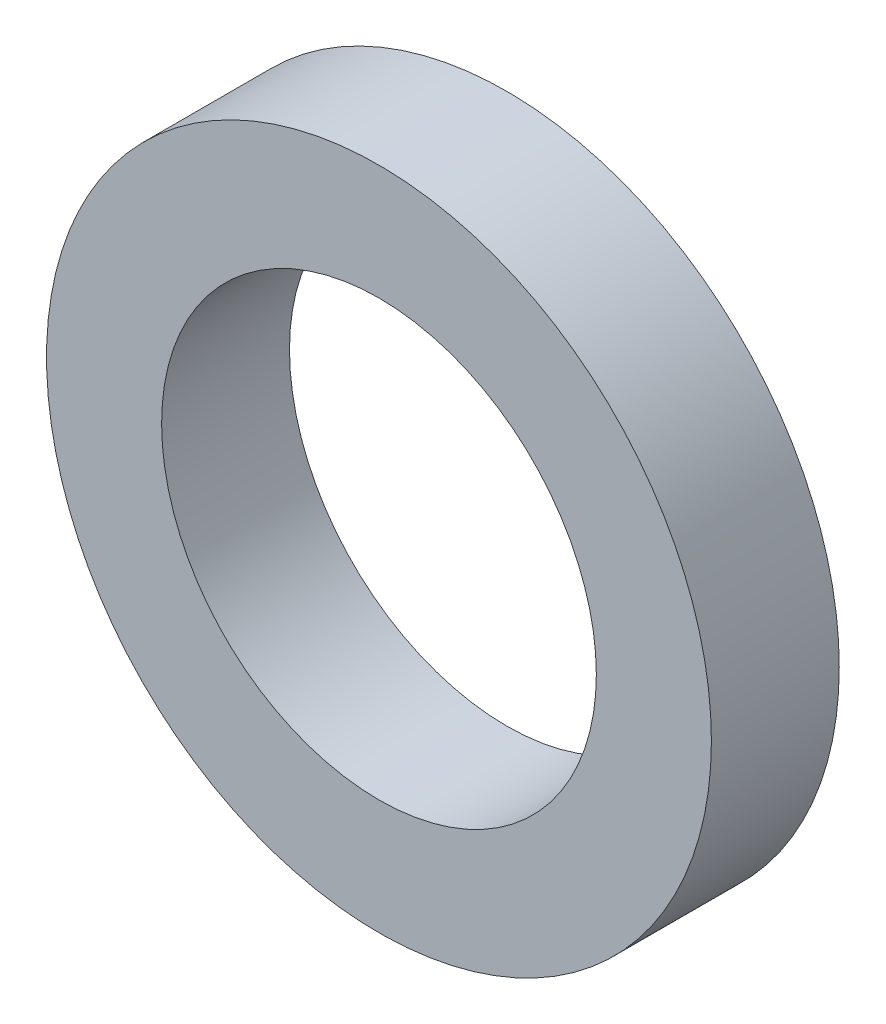
ISO-10303-21;
HEADER;
FILE_DESCRIPTION(('STEP AP214'),'2;1');
FILE_NAME('part.step','',(''),(''),'','','');
FILE_SCHEMA(('AUTOMOTIVE_DESIGN { 1 0 10303 214 1 1 1 1 }'));
ENDSEC;
DATA;
#1=APPLICATION_CONTEXT('core data for automotive mechanical design processes');
#2=APPLICATION_PROTOCOL_DEFINITION('international standard','automotive_design',2000,#1);
#3=PRODUCT_CONTEXT('',#1,'mechanical');
#4=PRODUCT('Part','Part','',(#3));
#5=PRODUCT_RELATED_PRODUCT_CATEGORY('part','',(#4));
#6=PRODUCT_DEFINITION_FORMATION('','',#4);
#7=PRODUCT_DEFINITION_CONTEXT('part definition',#1,'design');
#8=PRODUCT_DEFINITION('design','',#6,#7);
#9=PRODUCT_DEFINITION_SHAPE('','',#8);
#10=(LENGTH_UNIT() NAMED_UNIT(*) SI_UNIT(.MILLI.,.METRE.));
#11=(NAMED_UNIT(*) PLANE_ANGLE_UNIT() SI_UNIT($,.RADIAN.));
#12=(NAMED_UNIT(*) SI_UNIT($,.STERADIAN.) SOLID_ANGLE_UNIT());
#13=UNCERTAINTY_MEASURE_WITH_UNIT(LENGTH_MEASURE(1.E-05),#10,'distance_accuracy_value','');
#14=(GEOMETRIC_REPRESENTATION_CONTEXT(3) GLOBAL_UNCERTAINTY_ASSIGNED_CONTEXT((#13)) GLOBAL_UNIT_ASSIGNED_CONTEXT((#10,
#11,#12)) REPRESENTATION_CONTEXT('',''));
#15=CARTESIAN_POINT('',(0.,0.,0.));
#16=DIRECTION('',(0.,0.,1.));
#17=DIRECTION('',(1.,0.,0.));
#18=AXIS2_PLACEMENT_3D('',#15,#16,#17);
#19=CARTESIAN_POINT('',(0.,0.,5.));
#20=DIRECTION('',(0.,0.,1.));
#21=DIRECTION('',(1.,0.,0.));
#22=AXIS2_PLACEMENT_3D('',#19,#20,#21);
#23=PLANE('',#22);
#24=CARTESIAN_POINT('',(0.,0.,5.));
#25=DIRECTION('',(0.,0.,1.));
#26=DIRECTION('',(1.,0.,0.));
#27=AXIS2_PLACEMENT_3D('',#24,#25,#26);
#28=CIRCLE('',#27,13.);
#29=CARTESIAN_POINT('',(13.,0.,5.));
#30=VERTEX_POINT('',#29);
#31=EDGE_CURVE('E10',#30,#30,#28,.T.);
#32=ORIENTED_EDGE('',*,*,#31,.T.);
#33=EDGE_LOOP('',(#32));
#34=FACE_BOUND('',#33,.T.);
#35=CARTESIAN_POINT('',(0.,0.,5.));
#36=DIRECTION('',(0.,0.,1.));
#37=DIRECTION('',(1.,0.,0.));
#38=AXIS2_PLACEMENT_3D('',#35,#36,#37);
#39=CIRCLE('',#38,8.5);
#40=CARTESIAN_POINT('',(8.5,0.,5.));
#41=VERTEX_POINT('',#40);
#42=EDGE_CURVE('E43',#41,#41,#39,.T.);
#43=ORIENTED_EDGE('',*,*,#42,.F.);
#44=EDGE_LOOP('',(#43));
#45=FACE_BOUND('',#44,.T.);
#46=ADVANCED_FACE('F32',(#34,#45),#23,.T.);
#47=CARTESIAN_POINT('',(0.,0.,0.));
#48=DIRECTION('',(0.,0.,1.));
#49=DIRECTION('',(1.,0.,0.));
#50=AXIS2_PLACEMENT_3D('',#47,#48,#49);
#51=PLANE('',#50);
#52=CARTESIAN_POINT('',(0.,0.,0.));
#53=DIRECTION('',(0.,0.,1.));
#54=DIRECTION('',(1.,0.,0.));
#55=AXIS2_PLACEMENT_3D('',#52,#53,#54);
#56=CIRCLE('',#55,13.);
#57=CARTESIAN_POINT('',(13.,0.,0.));
#58=VERTEX_POINT('',#57);
#59=EDGE_CURVE('E36',#58,#58,#56,.T.);
#60=ORIENTED_EDGE('',*,*,#59,.F.);
#61=EDGE_LOOP('',(#60));
#62=FACE_BOUND('',#61,.T.);
#63=CARTESIAN_POINT('',(0.,0.,0.));
#64=DIRECTION('',(0.,0.,1.));
#65=DIRECTION('',(1.,0.,0.));
#66=AXIS2_PLACEMENT_3D('',#63,#64,#65);
#67=CIRCLE('',#66,8.5);
#68=CARTESIAN_POINT('',(8.5,0.,0.));
#69=VERTEX_POINT('',#68);
#70=EDGE_CURVE('E45',#69,#69,#67,.T.);
#71=ORIENTED_EDGE('',*,*,#70,.T.);
#72=EDGE_LOOP('',(#71));
#73=FACE_BOUND('',#72,.T.);
#74=ADVANCED_FACE('F55',(#62,#73),#51,.F.);
#75=CARTESIAN_POINT('',(0.,0.,5.));
#76=DIRECTION('',(0.,0.,-1.));
#77=DIRECTION('',(-1.,0.,0.));
#78=AXIS2_PLACEMENT_3D('',#75,#76,#77);
#79=CYLINDRICAL_SURFACE('',#78,13.);
#80=ORIENTED_EDGE('',*,*,#31,.F.);
#81=EDGE_LOOP('',(#80));
#82=FACE_BOUND('',#81,.T.);
#83=ORIENTED_EDGE('',*,*,#59,.T.);
#84=EDGE_LOOP('',(#83));
#85=FACE_BOUND('',#84,.T.);
#86=ADVANCED_FACE('F34',(#82,#85),#79,.T.);
#87=CARTESIAN_POINT('',(0.,0.,5.));
#88=DIRECTION('',(0.,0.,-1.));
#89=DIRECTION('',(-1.,0.,0.));
#90=AXIS2_PLACEMENT_3D('',#87,#88,#89);
#91=CYLINDRICAL_SURFACE('',#90,8.5);
#92=ORIENTED_EDGE('',*,*,#42,.T.);
#93=EDGE_LOOP('',(#92));
#94=FACE_BOUND('',#93,.T.);
#95=ORIENTED_EDGE('',*,*,#70,.F.);
#96=EDGE_LOOP('',(#95));
#97=FACE_BOUND('',#96,.T.);
#98=ADVANCED_FACE('F51',(#94,#97),#91,.F.);
#99=CLOSED_SHELL('',(#46,#74,#86,#98));
#100=MANIFOLD_SOLID_BREP('B2',#99);
#101=ADVANCED_BREP_SHAPE_REPRESENTATION('',(#18,#100),#14);
#102=SHAPE_DEFINITION_REPRESENTATION(#9,#101);
ENDSEC;
END-ISO-10303-21;
